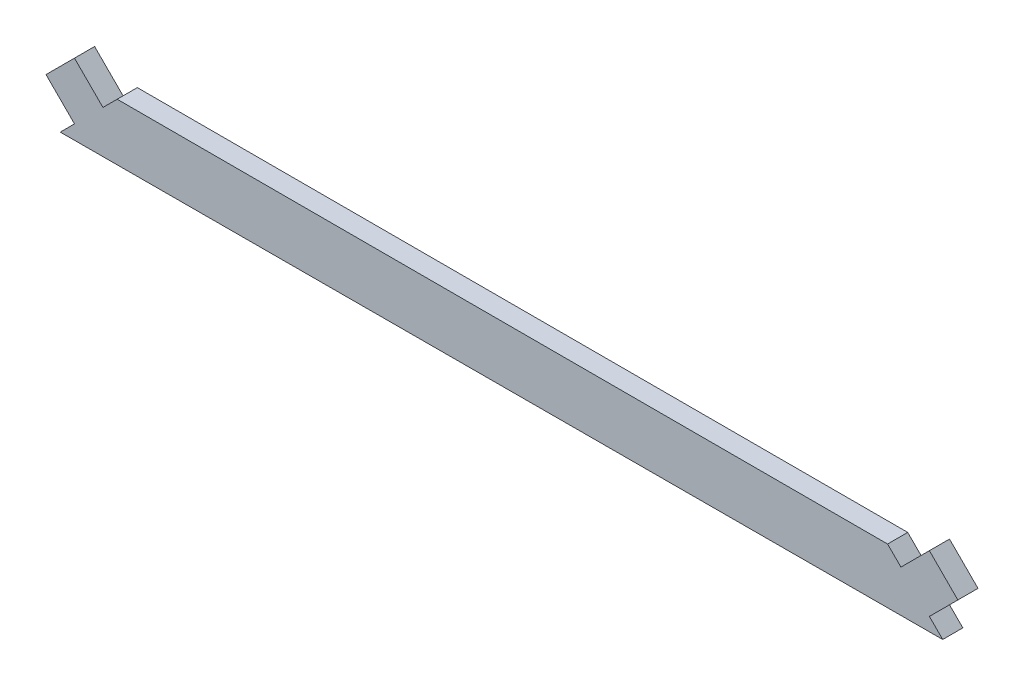
ISO-10303-21;
HEADER;
FILE_DESCRIPTION(('STEP AP214'),'2;1');
FILE_NAME('part.step','',(''),(''),'','','');
FILE_SCHEMA(('AUTOMOTIVE_DESIGN { 1 0 10303 214 1 1 1 1 }'));
ENDSEC;
DATA;
#1=APPLICATION_CONTEXT('core data for automotive mechanical design processes');
#2=APPLICATION_PROTOCOL_DEFINITION('international standard','automotive_design',2000,#1);
#3=PRODUCT_CONTEXT('',#1,'mechanical');
#4=PRODUCT('Part','Part','',(#3));
#5=PRODUCT_RELATED_PRODUCT_CATEGORY('part','',(#4));
#6=PRODUCT_DEFINITION_FORMATION('','',#4);
#7=PRODUCT_DEFINITION_CONTEXT('part definition',#1,'design');
#8=PRODUCT_DEFINITION('design','',#6,#7);
#9=PRODUCT_DEFINITION_SHAPE('','',#8);
#10=(LENGTH_UNIT() NAMED_UNIT(*) SI_UNIT(.MILLI.,.METRE.));
#11=(NAMED_UNIT(*) PLANE_ANGLE_UNIT() SI_UNIT($,.RADIAN.));
#12=(NAMED_UNIT(*) SI_UNIT($,.STERADIAN.) SOLID_ANGLE_UNIT());
#13=UNCERTAINTY_MEASURE_WITH_UNIT(LENGTH_MEASURE(1.E-05),#10,'distance_accuracy_value','');
#14=(GEOMETRIC_REPRESENTATION_CONTEXT(3) GLOBAL_UNCERTAINTY_ASSIGNED_CONTEXT((#13)) GLOBAL_UNIT_ASSIGNED_CONTEXT((#10,
#11,#12)) REPRESENTATION_CONTEXT('',''));
#15=CARTESIAN_POINT('',(0.,0.,0.));
#16=DIRECTION('',(0.,0.,1.));
#17=DIRECTION('',(1.,0.,0.));
#18=AXIS2_PLACEMENT_3D('',#15,#16,#17);
#19=CARTESIAN_POINT('',(-121.483295342202,-147.924388289873,3.175));
#20=DIRECTION('',(0.707106781186548,-0.707106781186547,0.));
#21=DIRECTION('',(0.707106781186547,0.707106781186548,0.));
#22=AXIS2_PLACEMENT_3D('',#19,#20,#21);
#23=PLANE('',#22);
#24=DIRECTION('',(0.,0.,-1.));
#25=VECTOR('',#24,1.);
#26=CARTESIAN_POINT('',(-125.973423402736,-152.414516350407,3.175));
#27=LINE('',#26,#25);
#28=CARTESIAN_POINT('',(-125.973423402736,-152.414516350407,3.175));
#29=VERTEX_POINT('',#28);
#30=CARTESIAN_POINT('',(-125.973423402736,-152.414516350407,-3.175));
#31=VERTEX_POINT('',#30);
#32=EDGE_CURVE('E229',#29,#31,#27,.T.);
#33=ORIENTED_EDGE('',*,*,#32,.F.);
#34=DIRECTION('',(-0.707106781186547,-0.707106781186548,0.));
#35=VECTOR('',#34,1.);
#36=CARTESIAN_POINT('',(-121.483295342202,-147.924388289873,3.175));
#37=LINE('',#36,#35);
#38=CARTESIAN_POINT('',(-121.483295342202,-147.924388289873,3.175));
#39=VERTEX_POINT('',#38);
#40=EDGE_CURVE('E145',#39,#29,#37,.T.);
#41=ORIENTED_EDGE('',*,*,#40,.F.);
#42=DIRECTION('',(0.,0.,-1.));
#43=VECTOR('',#42,1.);
#44=CARTESIAN_POINT('',(-121.483295342202,-147.924388289873,3.175));
#45=LINE('',#44,#43);
#46=CARTESIAN_POINT('',(-121.483295342202,-147.924388289873,-3.175));
#47=VERTEX_POINT('',#46);
#48=EDGE_CURVE('E169',#39,#47,#45,.T.);
#49=ORIENTED_EDGE('',*,*,#48,.T.);
#50=DIRECTION('',(-0.707106781186547,-0.707106781186548,0.));
#51=VECTOR('',#50,1.);
#52=CARTESIAN_POINT('',(-121.483295342202,-147.924388289873,-3.175));
#53=LINE('',#52,#51);
#54=EDGE_CURVE('E177',#47,#31,#53,.T.);
#55=ORIENTED_EDGE('',*,*,#54,.T.);
#56=EDGE_LOOP('',(#33,#41,#49,#55));
#57=FACE_BOUND('',#56,.T.);
#58=ADVANCED_FACE('F33',(#57),#23,.F.);
#59=CARTESIAN_POINT('',(138.870288723204,-165.311381670876,3.175));
#60=DIRECTION('',(-0.707106781186542,-0.707106781186553,0.));
#61=DIRECTION('',(0.707106781186553,-0.707106781186542,0.));
#62=AXIS2_PLACEMENT_3D('',#59,#60,#61);
#63=PLANE('',#62);
#64=DIRECTION('',(-0.707106781186553,0.707106781186542,0.));
#65=VECTOR('',#64,1.);
#66=CARTESIAN_POINT('',(138.870288723204,-165.311381670876,-3.175));
#67=LINE('',#66,#65);
#68=CARTESIAN_POINT('',(138.870288723204,-165.311381670876,-3.175));
#69=VERTEX_POINT('',#68);
#70=CARTESIAN_POINT('',(134.666920093237,-161.108013040909,-3.175));
#71=VERTEX_POINT('',#70);
#72=EDGE_CURVE('E150',#69,#71,#67,.T.);
#73=ORIENTED_EDGE('',*,*,#72,.T.);
#74=DIRECTION('',(0.,0.,-1.));
#75=VECTOR('',#74,1.);
#76=CARTESIAN_POINT('',(134.666920093237,-161.108013040909,287.177631070057));
#77=LINE('',#76,#75);
#78=CARTESIAN_POINT('',(134.666920093237,-161.108013040909,3.17499999999998));
#79=VERTEX_POINT('',#78);
#80=EDGE_CURVE('E218',#79,#71,#77,.T.);
#81=ORIENTED_EDGE('',*,*,#80,.F.);
#82=DIRECTION('',(-0.707106781186553,0.707106781186542,0.));
#83=VECTOR('',#82,1.);
#84=CARTESIAN_POINT('',(138.870288723204,-165.311381670876,3.175));
#85=LINE('',#84,#83);
#86=CARTESIAN_POINT('',(138.870288723204,-165.311381670876,3.175));
#87=VERTEX_POINT('',#86);
#88=EDGE_CURVE('E164',#87,#79,#85,.T.);
#89=ORIENTED_EDGE('',*,*,#88,.F.);
#90=DIRECTION('',(0.,0.,-1.));
#91=VECTOR('',#90,1.);
#92=CARTESIAN_POINT('',(138.870288723204,-165.311381670876,3.175));
#93=LINE('',#92,#91);
#94=EDGE_CURVE('E42',#87,#69,#93,.T.);
#95=ORIENTED_EDGE('',*,*,#94,.T.);
#96=EDGE_LOOP('',(#73,#81,#89,#95));
#97=FACE_BOUND('',#96,.T.);
#98=ADVANCED_FACE('F200',(#97),#63,.F.);
#99=CARTESIAN_POINT('',(-134.953679523805,-161.394772471477,3.175));
#100=VERTEX_POINT('',#99);
#101=CARTESIAN_POINT('',(-139.44380758434,-165.884900532011,3.175));
#102=VERTEX_POINT('',#101);
#103=EDGE_CURVE('E137',#100,#102,#37,.T.);
#104=ORIENTED_EDGE('',*,*,#103,.F.);
#105=DIRECTION('',(0.,0.,-1.));
#106=VECTOR('',#105,1.);
#107=CARTESIAN_POINT('',(-134.953679523805,-161.394772471477,3.175));
#108=LINE('',#107,#106);
#109=CARTESIAN_POINT('',(-134.953679523805,-161.394772471477,-3.175));
#110=VERTEX_POINT('',#109);
#111=EDGE_CURVE('E123',#100,#110,#108,.T.);
#112=ORIENTED_EDGE('',*,*,#111,.T.);
#113=CARTESIAN_POINT('',(-139.44380758434,-165.884900532011,-3.175));
#114=VERTEX_POINT('',#113);
#115=EDGE_CURVE('E175',#110,#114,#53,.T.);
#116=ORIENTED_EDGE('',*,*,#115,.T.);
#117=DIRECTION('',(0.,0.,-1.));
#118=VECTOR('',#117,1.);
#119=CARTESIAN_POINT('',(-139.44380758434,-165.884900532011,3.175));
#120=LINE('',#119,#118);
#121=EDGE_CURVE('E11',#102,#114,#120,.T.);
#122=ORIENTED_EDGE('',*,*,#121,.F.);
#123=EDGE_LOOP('',(#104,#112,#116,#122));
#124=FACE_BOUND('',#123,.T.);
#125=ADVANCED_FACE('F35',(#124),#23,.F.);
#126=CARTESIAN_POINT('',(-139.44380758434,-165.884900532011,3.175));
#127=DIRECTION('',(-0.0020606848558574,0.999997876786708,0.));
#128=DIRECTION('',(-0.999997876786708,-0.0020606848558574,0.));
#129=AXIS2_PLACEMENT_3D('',#126,#127,#128);
#130=PLANE('',#129);
#131=DIRECTION('',(0.999997876786708,0.0020606848558574,0.));
#132=VECTOR('',#131,1.);
#133=CARTESIAN_POINT('',(-139.44380758434,-165.884900532011,-3.175));
#134=LINE('',#133,#132);
#135=EDGE_CURVE('E172',#114,#69,#134,.T.);
#136=ORIENTED_EDGE('',*,*,#135,.T.);
#137=ORIENTED_EDGE('',*,*,#94,.F.);
#138=DIRECTION('',(0.999997876786708,0.0020606848558574,0.));
#139=VECTOR('',#138,1.);
#140=CARTESIAN_POINT('',(-139.44380758434,-165.884900532011,3.175));
#141=LINE('',#140,#139);
#142=EDGE_CURVE('E148',#102,#87,#141,.T.);
#143=ORIENTED_EDGE('',*,*,#142,.F.);
#144=ORIENTED_EDGE('',*,*,#121,.T.);
#145=EDGE_LOOP('',(#136,#137,#143,#144));
#146=FACE_BOUND('',#145,.T.);
#147=ADVANCED_FACE('F197',(#146),#130,.F.);
#148=CARTESIAN_POINT('',(125.686663972168,-152.12775691984,3.175));
#149=VERTEX_POINT('',#148);
#150=CARTESIAN_POINT('',(121.483295342201,-147.924388289873,3.175));
#151=VERTEX_POINT('',#150);
#152=EDGE_CURVE('E163',#149,#151,#85,.T.);
#153=ORIENTED_EDGE('',*,*,#152,.F.);
#154=DIRECTION('',(0.,0.,-1.));
#155=VECTOR('',#154,1.);
#156=CARTESIAN_POINT('',(125.686663972168,-152.12775691984,287.177631070057));
#157=LINE('',#156,#155);
#158=CARTESIAN_POINT('',(125.686663972168,-152.12775691984,-3.175));
#159=VERTEX_POINT('',#158);
#160=EDGE_CURVE('E58',#149,#159,#157,.T.);
#161=ORIENTED_EDGE('',*,*,#160,.T.);
#162=CARTESIAN_POINT('',(121.483295342201,-147.924388289873,-3.175));
#163=VERTEX_POINT('',#162);
#164=EDGE_CURVE('E187',#159,#163,#67,.T.);
#165=ORIENTED_EDGE('',*,*,#164,.T.);
#166=DIRECTION('',(0.,0.,-1.));
#167=VECTOR('',#166,1.);
#168=CARTESIAN_POINT('',(121.483295342201,-147.924388289873,3.175));
#169=LINE('',#168,#167);
#170=EDGE_CURVE('E182',#151,#163,#169,.T.);
#171=ORIENTED_EDGE('',*,*,#170,.F.);
#172=EDGE_LOOP('',(#153,#161,#165,#171));
#173=FACE_BOUND('',#172,.T.);
#174=ADVANCED_FACE('F256',(#173),#63,.F.);
#175=CARTESIAN_POINT('',(121.483295342201,-147.924388289873,3.175));
#176=DIRECTION('',(0.,-1.,0.));
#177=DIRECTION('',(1.,0.,0.));
#178=AXIS2_PLACEMENT_3D('',#175,#176,#177);
#179=PLANE('',#178);
#180=DIRECTION('',(-1.,0.,0.));
#181=VECTOR('',#180,1.);
#182=CARTESIAN_POINT('',(121.483295342201,-147.924388289873,-3.175));
#183=LINE('',#182,#181);
#184=EDGE_CURVE('E146',#163,#47,#183,.T.);
#185=ORIENTED_EDGE('',*,*,#184,.T.);
#186=ORIENTED_EDGE('',*,*,#48,.F.);
#187=DIRECTION('',(-1.,0.,0.));
#188=VECTOR('',#187,1.);
#189=CARTESIAN_POINT('',(121.483295342201,-147.924388289873,3.175));
#190=LINE('',#189,#188);
#191=EDGE_CURVE('E167',#151,#39,#190,.T.);
#192=ORIENTED_EDGE('',*,*,#191,.F.);
#193=ORIENTED_EDGE('',*,*,#170,.T.);
#194=EDGE_LOOP('',(#185,#186,#192,#193));
#195=FACE_BOUND('',#194,.T.);
#196=ADVANCED_FACE('F260',(#195),#179,.F.);
#197=CARTESIAN_POINT('',(0.,0.,3.175));
#198=DIRECTION('',(0.,0.,-1.));
#199=DIRECTION('',(-1.,0.,0.));
#200=AXIS2_PLACEMENT_3D('',#197,#198,#199);
#201=PLANE('',#200);
#202=ORIENTED_EDGE('',*,*,#40,.T.);
#203=DIRECTION('',(0.707106781186547,-0.707106781186547,0.));
#204=VECTOR('',#203,1.);
#205=CARTESIAN_POINT('',(-125.973423402736,-152.414516350407,3.175));
#206=LINE('',#205,#204);
#207=CARTESIAN_POINT('',(-134.953679523805,-143.434260229338,3.175));
#208=VERTEX_POINT('',#207);
#209=EDGE_CURVE('E131',#208,#29,#206,.T.);
#210=ORIENTED_EDGE('',*,*,#209,.F.);
#211=DIRECTION('',(0.707106781186547,0.707106781186547,0.));
#212=VECTOR('',#211,1.);
#213=CARTESIAN_POINT('',(-134.953679523805,-143.434260229338,3.175));
#214=LINE('',#213,#212);
#215=CARTESIAN_POINT('',(-143.933935644875,-152.414516350407,3.175));
#216=VERTEX_POINT('',#215);
#217=EDGE_CURVE('E141',#216,#208,#214,.T.);
#218=ORIENTED_EDGE('',*,*,#217,.F.);
#219=DIRECTION('',(-0.707106781186547,0.707106781186547,0.));
#220=VECTOR('',#219,1.);
#221=CARTESIAN_POINT('',(-143.933935644875,-152.414516350407,3.175));
#222=LINE('',#221,#220);
#223=EDGE_CURVE('E126',#100,#216,#222,.T.);
#224=ORIENTED_EDGE('',*,*,#223,.F.);
#225=ORIENTED_EDGE('',*,*,#103,.T.);
#226=ORIENTED_EDGE('',*,*,#142,.T.);
#227=ORIENTED_EDGE('',*,*,#88,.T.);
#228=DIRECTION('',(0.707106781186544,0.707106781186551,0.));
#229=VECTOR('',#228,1.);
#230=CARTESIAN_POINT('',(143.647176214306,-152.127756919839,3.17499999999998));
#231=LINE('',#230,#229);
#232=CARTESIAN_POINT('',(143.647176214306,-152.127756919839,3.17499999999998));
#233=VERTEX_POINT('',#232);
#234=EDGE_CURVE('E233',#79,#233,#231,.T.);
#235=ORIENTED_EDGE('',*,*,#234,.T.);
#236=DIRECTION('',(-0.707106781186552,0.707106781186543,0.));
#237=VECTOR('',#236,1.);
#238=CARTESIAN_POINT('',(134.666920093237,-143.14750079877,3.17499999999998));
#239=LINE('',#238,#237);
#240=CARTESIAN_POINT('',(134.666920093237,-143.14750079877,3.17499999999998));
#241=VERTEX_POINT('',#240);
#242=EDGE_CURVE('E220',#233,#241,#239,.T.);
#243=ORIENTED_EDGE('',*,*,#242,.T.);
#244=DIRECTION('',(-0.707106781186543,-0.707106781186552,0.));
#245=VECTOR('',#244,1.);
#246=CARTESIAN_POINT('',(125.686663972168,-152.12775691984,3.17499999999998));
#247=LINE('',#246,#245);
#248=EDGE_CURVE('E159',#241,#149,#247,.T.);
#249=ORIENTED_EDGE('',*,*,#248,.T.);
#250=ORIENTED_EDGE('',*,*,#152,.T.);
#251=ORIENTED_EDGE('',*,*,#191,.T.);
#252=EDGE_LOOP('',(#202,#210,#218,#224,#225,#226,#227,#235,#243,#249,#250,#251));
#253=FACE_BOUND('',#252,.T.);
#254=ADVANCED_FACE('F136',(#253),#201,.F.);
#255=CARTESIAN_POINT('',(0.,0.,-3.175));
#256=DIRECTION('',(0.,0.,-1.));
#257=DIRECTION('',(-1.,0.,0.));
#258=AXIS2_PLACEMENT_3D('',#255,#256,#257);
#259=PLANE('',#258);
#260=ORIENTED_EDGE('',*,*,#54,.F.);
#261=ORIENTED_EDGE('',*,*,#184,.F.);
#262=ORIENTED_EDGE('',*,*,#164,.F.);
#263=DIRECTION('',(0.707106781186543,0.707106781186552,0.));
#264=VECTOR('',#263,1.);
#265=CARTESIAN_POINT('',(125.686663972168,-152.12775691984,-3.175));
#266=LINE('',#265,#264);
#267=CARTESIAN_POINT('',(134.666920093237,-143.14750079877,-3.175));
#268=VERTEX_POINT('',#267);
#269=EDGE_CURVE('E214',#159,#268,#266,.T.);
#270=ORIENTED_EDGE('',*,*,#269,.T.);
#271=DIRECTION('',(0.707106781186552,-0.707106781186543,0.));
#272=VECTOR('',#271,1.);
#273=CARTESIAN_POINT('',(134.666920093237,-143.14750079877,-3.175));
#274=LINE('',#273,#272);
#275=CARTESIAN_POINT('',(143.647176214306,-152.127756919839,-3.175));
#276=VERTEX_POINT('',#275);
#277=EDGE_CURVE('E209',#268,#276,#274,.T.);
#278=ORIENTED_EDGE('',*,*,#277,.T.);
#279=DIRECTION('',(-0.707106781186544,-0.707106781186551,0.));
#280=VECTOR('',#279,1.);
#281=CARTESIAN_POINT('',(143.647176214306,-152.127756919839,-3.175));
#282=LINE('',#281,#280);
#283=EDGE_CURVE('E206',#276,#71,#282,.T.);
#284=ORIENTED_EDGE('',*,*,#283,.T.);
#285=ORIENTED_EDGE('',*,*,#72,.F.);
#286=ORIENTED_EDGE('',*,*,#135,.F.);
#287=ORIENTED_EDGE('',*,*,#115,.F.);
#288=DIRECTION('',(-0.707106781186547,0.707106781186547,0.));
#289=VECTOR('',#288,1.);
#290=CARTESIAN_POINT('',(-143.933935644875,-152.414516350407,-3.175));
#291=LINE('',#290,#289);
#292=CARTESIAN_POINT('',(-143.933935644875,-152.414516350407,-3.175));
#293=VERTEX_POINT('',#292);
#294=EDGE_CURVE('E50',#110,#293,#291,.T.);
#295=ORIENTED_EDGE('',*,*,#294,.T.);
#296=DIRECTION('',(0.707106781186547,0.707106781186547,0.));
#297=VECTOR('',#296,1.);
#298=CARTESIAN_POINT('',(-134.953679523805,-143.434260229338,-3.175));
#299=LINE('',#298,#297);
#300=CARTESIAN_POINT('',(-134.953679523805,-143.434260229338,-3.175));
#301=VERTEX_POINT('',#300);
#302=EDGE_CURVE('E247',#293,#301,#299,.T.);
#303=ORIENTED_EDGE('',*,*,#302,.T.);
#304=DIRECTION('',(0.707106781186547,-0.707106781186547,0.));
#305=VECTOR('',#304,1.);
#306=CARTESIAN_POINT('',(-125.973423402736,-152.414516350407,-3.175));
#307=LINE('',#306,#305);
#308=EDGE_CURVE('E142',#301,#31,#307,.T.);
#309=ORIENTED_EDGE('',*,*,#308,.T.);
#310=EDGE_LOOP('',(#260,#261,#262,#270,#278,#284,#285,#286,#287,#295,#303,#309));
#311=FACE_BOUND('',#310,.T.);
#312=ADVANCED_FACE('F203',(#311),#259,.T.);
#313=CARTESIAN_POINT('',(143.647176214306,-152.127756919839,287.177631070057));
#314=DIRECTION('',(0.707106781186551,-0.707106781186544,0.));
#315=DIRECTION('',(0.707106781186544,0.707106781186551,0.));
#316=AXIS2_PLACEMENT_3D('',#313,#314,#315);
#317=PLANE('',#316);
#318=ORIENTED_EDGE('',*,*,#234,.F.);
#319=ORIENTED_EDGE('',*,*,#80,.T.);
#320=ORIENTED_EDGE('',*,*,#283,.F.);
#321=DIRECTION('',(0.,0.,-1.));
#322=VECTOR('',#321,1.);
#323=CARTESIAN_POINT('',(143.647176214306,-152.127756919839,287.177631070057));
#324=LINE('',#323,#322);
#325=EDGE_CURVE('E221',#233,#276,#324,.T.);
#326=ORIENTED_EDGE('',*,*,#325,.F.);
#327=EDGE_LOOP('',(#318,#319,#320,#326));
#328=FACE_BOUND('',#327,.T.);
#329=ADVANCED_FACE('F292',(#328),#317,.T.);
#330=CARTESIAN_POINT('',(134.666920093237,-143.14750079877,287.177631070057));
#331=DIRECTION('',(0.707106781186543,0.707106781186552,0.));
#332=DIRECTION('',(-0.707106781186552,0.707106781186543,0.));
#333=AXIS2_PLACEMENT_3D('',#330,#331,#332);
#334=PLANE('',#333);
#335=ORIENTED_EDGE('',*,*,#242,.F.);
#336=ORIENTED_EDGE('',*,*,#325,.T.);
#337=ORIENTED_EDGE('',*,*,#277,.F.);
#338=DIRECTION('',(0.,0.,-1.));
#339=VECTOR('',#338,1.);
#340=CARTESIAN_POINT('',(134.666920093237,-143.14750079877,287.177631070057));
#341=LINE('',#340,#339);
#342=EDGE_CURVE('E213',#241,#268,#341,.T.);
#343=ORIENTED_EDGE('',*,*,#342,.F.);
#344=EDGE_LOOP('',(#335,#336,#337,#343));
#345=FACE_BOUND('',#344,.T.);
#346=ADVANCED_FACE('F227',(#345),#334,.T.);
#347=CARTESIAN_POINT('',(125.686663972168,-152.12775691984,287.177631070057));
#348=DIRECTION('',(-0.707106781186552,0.707106781186543,0.));
#349=DIRECTION('',(-0.707106781186543,-0.707106781186552,0.));
#350=AXIS2_PLACEMENT_3D('',#347,#348,#349);
#351=PLANE('',#350);
#352=ORIENTED_EDGE('',*,*,#248,.F.);
#353=ORIENTED_EDGE('',*,*,#342,.T.);
#354=ORIENTED_EDGE('',*,*,#269,.F.);
#355=ORIENTED_EDGE('',*,*,#160,.F.);
#356=EDGE_LOOP('',(#352,#353,#354,#355));
#357=FACE_BOUND('',#356,.T.);
#358=ADVANCED_FACE('F224',(#357),#351,.T.);
#359=CARTESIAN_POINT('',(-125.973423402736,-152.414516350407,3.175));
#360=DIRECTION('',(0.707106781186548,0.707106781186548,0.));
#361=DIRECTION('',(-0.707106781186548,0.707106781186548,0.));
#362=AXIS2_PLACEMENT_3D('',#359,#360,#361);
#363=PLANE('',#362);
#364=ORIENTED_EDGE('',*,*,#308,.F.);
#365=DIRECTION('',(0.,0.,-1.));
#366=VECTOR('',#365,1.);
#367=CARTESIAN_POINT('',(-134.953679523805,-143.434260229338,3.175));
#368=LINE('',#367,#366);
#369=EDGE_CURVE('E230',#208,#301,#368,.T.);
#370=ORIENTED_EDGE('',*,*,#369,.F.);
#371=ORIENTED_EDGE('',*,*,#209,.T.);
#372=ORIENTED_EDGE('',*,*,#32,.T.);
#373=EDGE_LOOP('',(#364,#370,#371,#372));
#374=FACE_BOUND('',#373,.T.);
#375=ADVANCED_FACE('F265',(#374),#363,.T.);
#376=CARTESIAN_POINT('',(-134.953679523805,-143.434260229338,3.175));
#377=DIRECTION('',(-0.707106781186548,0.707106781186548,0.));
#378=DIRECTION('',(-0.707106781186548,-0.707106781186548,0.));
#379=AXIS2_PLACEMENT_3D('',#376,#377,#378);
#380=PLANE('',#379);
#381=ORIENTED_EDGE('',*,*,#302,.F.);
#382=DIRECTION('',(0.,0.,-1.));
#383=VECTOR('',#382,1.);
#384=CARTESIAN_POINT('',(-143.933935644875,-152.414516350407,3.175));
#385=LINE('',#384,#383);
#386=EDGE_CURVE('E130',#216,#293,#385,.T.);
#387=ORIENTED_EDGE('',*,*,#386,.F.);
#388=ORIENTED_EDGE('',*,*,#217,.T.);
#389=ORIENTED_EDGE('',*,*,#369,.T.);
#390=EDGE_LOOP('',(#381,#387,#388,#389));
#391=FACE_BOUND('',#390,.T.);
#392=ADVANCED_FACE('F252',(#391),#380,.T.);
#393=CARTESIAN_POINT('',(-143.933935644875,-152.414516350407,3.175));
#394=DIRECTION('',(-0.707106781186548,-0.707106781186548,0.));
#395=DIRECTION('',(0.707106781186548,-0.707106781186548,0.));
#396=AXIS2_PLACEMENT_3D('',#393,#394,#395);
#397=PLANE('',#396);
#398=ORIENTED_EDGE('',*,*,#294,.F.);
#399=ORIENTED_EDGE('',*,*,#111,.F.);
#400=ORIENTED_EDGE('',*,*,#223,.T.);
#401=ORIENTED_EDGE('',*,*,#386,.T.);
#402=EDGE_LOOP('',(#398,#399,#400,#401));
#403=FACE_BOUND('',#402,.T.);
#404=ADVANCED_FACE('F125',(#403),#397,.T.);
#405=CLOSED_SHELL('',(#58,#98,#125,#147,#174,#196,#254,#312,#329,#346,#358,#375,#392,#404));
#406=MANIFOLD_SOLID_BREP('B2',#405);
#407=ADVANCED_BREP_SHAPE_REPRESENTATION('',(#18,#406),#14);
#408=SHAPE_DEFINITION_REPRESENTATION(#9,#407);
ENDSEC;
END-ISO-10303-21;
